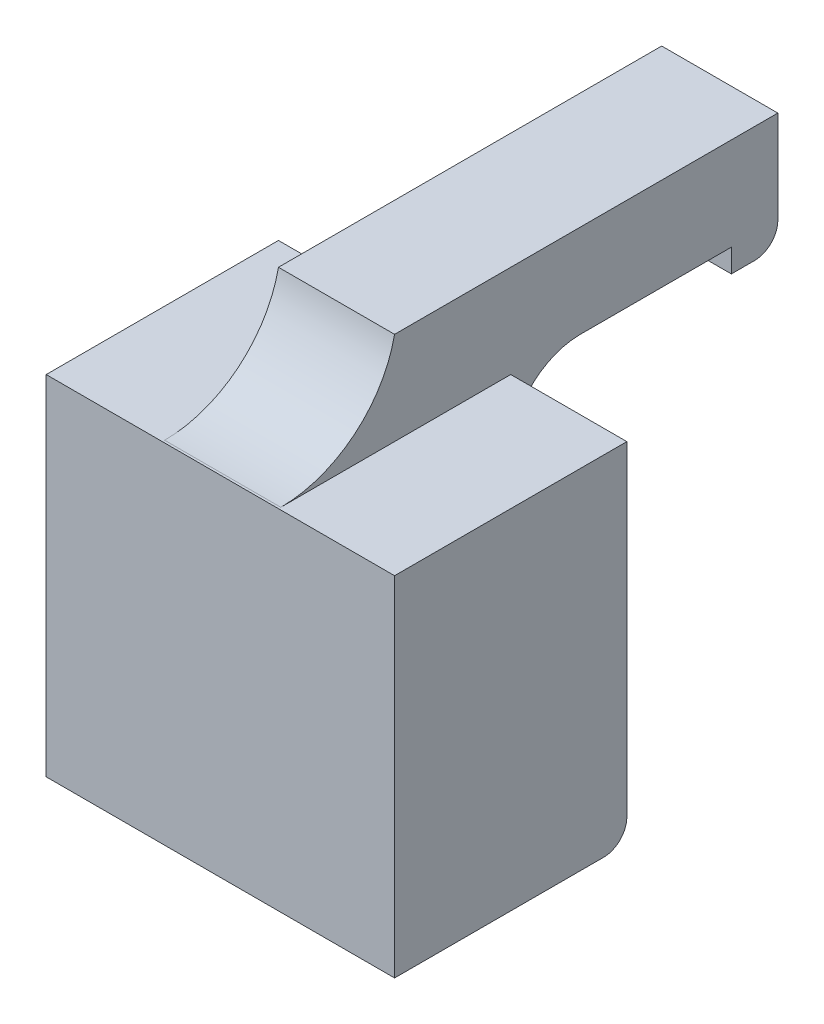
ISO-10303-21;
HEADER;
FILE_DESCRIPTION(('STEP AP214'),'2;1');
FILE_NAME('part.step','',(''),(''),'','','');
FILE_SCHEMA(('AUTOMOTIVE_DESIGN { 1 0 10303 214 1 1 1 1 }'));
ENDSEC;
DATA;
#1=APPLICATION_CONTEXT('core data for automotive mechanical design processes');
#2=APPLICATION_PROTOCOL_DEFINITION('international standard','automotive_design',2000,#1);
#3=PRODUCT_CONTEXT('',#1,'mechanical');
#4=PRODUCT('Part','Part','',(#3));
#5=PRODUCT_RELATED_PRODUCT_CATEGORY('part','',(#4));
#6=PRODUCT_DEFINITION_FORMATION('','',#4);
#7=PRODUCT_DEFINITION_CONTEXT('part definition',#1,'design');
#8=PRODUCT_DEFINITION('design','',#6,#7);
#9=PRODUCT_DEFINITION_SHAPE('','',#8);
#10=(LENGTH_UNIT() NAMED_UNIT(*) SI_UNIT(.MILLI.,.METRE.));
#11=(NAMED_UNIT(*) PLANE_ANGLE_UNIT() SI_UNIT($,.RADIAN.));
#12=(NAMED_UNIT(*) SI_UNIT($,.STERADIAN.) SOLID_ANGLE_UNIT());
#13=UNCERTAINTY_MEASURE_WITH_UNIT(LENGTH_MEASURE(1.E-05),#10,'distance_accuracy_value','');
#14=(GEOMETRIC_REPRESENTATION_CONTEXT(3) GLOBAL_UNCERTAINTY_ASSIGNED_CONTEXT((#13)) GLOBAL_UNIT_ASSIGNED_CONTEXT((#10,
#11,#12)) REPRESENTATION_CONTEXT('',''));
#15=CARTESIAN_POINT('',(0.,0.,0.));
#16=DIRECTION('',(0.,0.,1.));
#17=DIRECTION('',(1.,0.,0.));
#18=AXIS2_PLACEMENT_3D('',#15,#16,#17);
#19=CARTESIAN_POINT('',(0.,7.5,0.));
#20=DIRECTION('',(0.,1.,0.));
#21=DIRECTION('',(0.,0.,1.));
#22=AXIS2_PLACEMENT_3D('',#19,#20,#21);
#23=PLANE('',#22);
#24=DIRECTION('',(-1.,0.,0.));
#25=VECTOR('',#24,1.);
#26=CARTESIAN_POINT('',(-2.5,7.5,-9.5));
#27=LINE('',#26,#25);
#28=CARTESIAN_POINT('',(2.5,7.5,-9.5));
#29=VERTEX_POINT('',#28);
#30=CARTESIAN_POINT('',(-2.5,7.5,-9.5));
#31=VERTEX_POINT('',#30);
#32=EDGE_CURVE('E224',#29,#31,#27,.T.);
#33=ORIENTED_EDGE('',*,*,#32,.F.);
#34=DIRECTION('',(0.,0.,1.));
#35=VECTOR('',#34,1.);
#36=CARTESIAN_POINT('',(2.5,7.5,0.));
#37=LINE('',#36,#35);
#38=CARTESIAN_POINT('',(2.5,7.5,-3.));
#39=VERTEX_POINT('',#38);
#40=EDGE_CURVE('E257',#29,#39,#37,.T.);
#41=ORIENTED_EDGE('',*,*,#40,.T.);
#42=DIRECTION('',(-1.,0.,0.));
#43=VECTOR('',#42,1.);
#44=CARTESIAN_POINT('',(0.,7.5,-3.));
#45=LINE('',#44,#43);
#46=CARTESIAN_POINT('',(-2.5,7.5,-3.));
#47=VERTEX_POINT('',#46);
#48=EDGE_CURVE('E342',#39,#47,#45,.T.);
#49=ORIENTED_EDGE('',*,*,#48,.T.);
#50=DIRECTION('',(0.,0.,-1.));
#51=VECTOR('',#50,1.);
#52=CARTESIAN_POINT('',(-2.5,7.5,0.));
#53=LINE('',#52,#51);
#54=EDGE_CURVE('E251',#47,#31,#53,.T.);
#55=ORIENTED_EDGE('',*,*,#54,.T.);
#56=EDGE_LOOP('',(#33,#41,#49,#55));
#57=FACE_BOUND('',#56,.T.);
#58=ADVANCED_FACE('F41',(#57),#23,.F.);
#59=CARTESIAN_POINT('',(7.5,-7.5,10.));
#60=DIRECTION('',(-1.,0.,0.));
#61=DIRECTION('',(0.,0.,1.));
#62=AXIS2_PLACEMENT_3D('',#59,#60,#61);
#63=PLANE('',#62);
#64=DIRECTION('',(0.,0.,-1.));
#65=VECTOR('',#64,1.);
#66=CARTESIAN_POINT('',(7.5,-7.5,10.));
#67=LINE('',#66,#65);
#68=CARTESIAN_POINT('',(7.5,-7.5,10.));
#69=VERTEX_POINT('',#68);
#70=CARTESIAN_POINT('',(7.5,-7.5,0.999999999999999));
#71=VERTEX_POINT('',#70);
#72=EDGE_CURVE('E308',#69,#71,#67,.T.);
#73=ORIENTED_EDGE('',*,*,#72,.T.);
#74=CARTESIAN_POINT('',(7.5,-6.5,0.999999999999999));
#75=DIRECTION('',(-1.,0.,0.));
#76=DIRECTION('',(0.,0.,1.));
#77=AXIS2_PLACEMENT_3D('',#74,#75,#76);
#78=CIRCLE('',#77,1.);
#79=CARTESIAN_POINT('',(7.5,-6.5,0.));
#80=VERTEX_POINT('',#79);
#81=EDGE_CURVE('E64',#71,#80,#78,.F.);
#82=ORIENTED_EDGE('',*,*,#81,.T.);
#83=DIRECTION('',(0.,1.,0.));
#84=VECTOR('',#83,1.);
#85=CARTESIAN_POINT('',(7.5,-7.5,0.));
#86=LINE('',#85,#84);
#87=CARTESIAN_POINT('',(7.5,7.5,0.));
#88=VERTEX_POINT('',#87);
#89=EDGE_CURVE('E288',#80,#88,#86,.T.);
#90=ORIENTED_EDGE('',*,*,#89,.T.);
#91=DIRECTION('',(0.,0.,-1.));
#92=VECTOR('',#91,1.);
#93=CARTESIAN_POINT('',(7.5,7.5,10.));
#94=LINE('',#93,#92);
#95=CARTESIAN_POINT('',(7.5,7.5,10.));
#96=VERTEX_POINT('',#95);
#97=EDGE_CURVE('E293',#96,#88,#94,.T.);
#98=ORIENTED_EDGE('',*,*,#97,.F.);
#99=DIRECTION('',(0.,1.,0.));
#100=VECTOR('',#99,1.);
#101=CARTESIAN_POINT('',(7.5,-7.5,10.));
#102=LINE('',#101,#100);
#103=EDGE_CURVE('E294',#69,#96,#102,.T.);
#104=ORIENTED_EDGE('',*,*,#103,.F.);
#105=EDGE_LOOP('',(#73,#82,#90,#98,#104));
#106=FACE_BOUND('',#105,.T.);
#107=ADVANCED_FACE('F442',(#106),#63,.F.);
#108=CARTESIAN_POINT('',(-7.5,7.5,10.));
#109=DIRECTION('',(0.,-1.,0.));
#110=DIRECTION('',(0.,0.,-1.));
#111=AXIS2_PLACEMENT_3D('',#108,#109,#110);
#112=PLANE('',#111);
#113=CARTESIAN_POINT('',(2.5,7.5,0.));
#114=VERTEX_POINT('',#113);
#115=CARTESIAN_POINT('',(2.5,7.5,9.89897948556636));
#116=VERTEX_POINT('',#115);
#117=EDGE_CURVE('E276',#114,#116,#37,.T.);
#118=ORIENTED_EDGE('',*,*,#117,.T.);
#119=DIRECTION('',(1.,0.,0.));
#120=VECTOR('',#119,1.);
#121=CARTESIAN_POINT('',(-7.5,7.5,9.89897948556636));
#122=LINE('',#121,#120);
#123=CARTESIAN_POINT('',(-2.5,7.5,9.89897948556636));
#124=VERTEX_POINT('',#123);
#125=EDGE_CURVE('E331',#116,#124,#122,.F.);
#126=ORIENTED_EDGE('',*,*,#125,.T.);
#127=CARTESIAN_POINT('',(-2.5,7.5,0.));
#128=VERTEX_POINT('',#127);
#129=EDGE_CURVE('E270',#124,#128,#53,.T.);
#130=ORIENTED_EDGE('',*,*,#129,.T.);
#131=DIRECTION('',(-1.,0.,0.));
#132=VECTOR('',#131,1.);
#133=CARTESIAN_POINT('',(-7.5,7.5,0.));
#134=LINE('',#133,#132);
#135=CARTESIAN_POINT('',(-7.5,7.5,0.));
#136=VERTEX_POINT('',#135);
#137=EDGE_CURVE('E311',#128,#136,#134,.T.);
#138=ORIENTED_EDGE('',*,*,#137,.T.);
#139=DIRECTION('',(0.,0.,-1.));
#140=VECTOR('',#139,1.);
#141=CARTESIAN_POINT('',(-7.5,7.5,10.));
#142=LINE('',#141,#140);
#143=CARTESIAN_POINT('',(-7.5,7.5,10.));
#144=VERTEX_POINT('',#143);
#145=EDGE_CURVE('E324',#144,#136,#142,.T.);
#146=ORIENTED_EDGE('',*,*,#145,.F.);
#147=DIRECTION('',(-1.,0.,0.));
#148=VECTOR('',#147,1.);
#149=CARTESIAN_POINT('',(-7.5,7.5,10.));
#150=LINE('',#149,#148);
#151=EDGE_CURVE('E298',#96,#144,#150,.T.);
#152=ORIENTED_EDGE('',*,*,#151,.F.);
#153=ORIENTED_EDGE('',*,*,#97,.T.);
#154=EDGE_CURVE('E312',#88,#114,#134,.T.);
#155=ORIENTED_EDGE('',*,*,#154,.T.);
#156=EDGE_LOOP('',(#118,#126,#130,#138,#146,#152,#153,#155));
#157=FACE_BOUND('',#156,.T.);
#158=ADVANCED_FACE('F422',(#157),#112,.F.);
#159=CARTESIAN_POINT('',(-7.5,-7.5,10.));
#160=DIRECTION('',(1.,0.,0.));
#161=DIRECTION('',(0.,0.,-1.));
#162=AXIS2_PLACEMENT_3D('',#159,#160,#161);
#163=PLANE('',#162);
#164=DIRECTION('',(0.,-1.,0.));
#165=VECTOR('',#164,1.);
#166=CARTESIAN_POINT('',(-7.5,-7.5,0.));
#167=LINE('',#166,#165);
#168=CARTESIAN_POINT('',(-7.5,-6.5,0.));
#169=VERTEX_POINT('',#168);
#170=EDGE_CURVE('E299',#136,#169,#167,.T.);
#171=ORIENTED_EDGE('',*,*,#170,.T.);
#172=CARTESIAN_POINT('',(-7.5,-6.5,0.999999999999999));
#173=DIRECTION('',(1.,0.,0.));
#174=DIRECTION('',(0.,0.,-1.));
#175=AXIS2_PLACEMENT_3D('',#172,#173,#174);
#176=CIRCLE('',#175,1.);
#177=CARTESIAN_POINT('',(-7.5,-7.5,0.999999999999999));
#178=VERTEX_POINT('',#177);
#179=EDGE_CURVE('E11',#169,#178,#176,.F.);
#180=ORIENTED_EDGE('',*,*,#179,.T.);
#181=DIRECTION('',(0.,0.,-1.));
#182=VECTOR('',#181,1.);
#183=CARTESIAN_POINT('',(-7.5,-7.5,10.));
#184=LINE('',#183,#182);
#185=CARTESIAN_POINT('',(-7.5,-7.5,10.));
#186=VERTEX_POINT('',#185);
#187=EDGE_CURVE('E320',#186,#178,#184,.T.);
#188=ORIENTED_EDGE('',*,*,#187,.F.);
#189=DIRECTION('',(0.,-1.,0.));
#190=VECTOR('',#189,1.);
#191=CARTESIAN_POINT('',(-7.5,-7.5,10.));
#192=LINE('',#191,#190);
#193=EDGE_CURVE('E302',#144,#186,#192,.T.);
#194=ORIENTED_EDGE('',*,*,#193,.F.);
#195=ORIENTED_EDGE('',*,*,#145,.T.);
#196=EDGE_LOOP('',(#171,#180,#188,#194,#195));
#197=FACE_BOUND('',#196,.T.);
#198=ADVANCED_FACE('F434',(#197),#163,.F.);
#199=CARTESIAN_POINT('',(-7.5,-7.5,10.));
#200=DIRECTION('',(0.,1.,0.));
#201=DIRECTION('',(0.,0.,1.));
#202=AXIS2_PLACEMENT_3D('',#199,#200,#201);
#203=PLANE('',#202);
#204=DIRECTION('',(1.,0.,0.));
#205=VECTOR('',#204,1.);
#206=CARTESIAN_POINT('',(0.,-7.5,1.16149794846327));
#207=LINE('',#206,#205);
#208=CARTESIAN_POINT('',(-2.75,-7.5,1.16149794846327));
#209=VERTEX_POINT('',#208);
#210=CARTESIAN_POINT('',(2.75,-7.5,1.16149794846327));
#211=VERTEX_POINT('',#210);
#212=EDGE_CURVE('E214',#209,#211,#207,.T.);
#213=ORIENTED_EDGE('',*,*,#212,.F.);
#214=DIRECTION('',(0.,0.,-1.));
#215=VECTOR('',#214,1.);
#216=CARTESIAN_POINT('',(-2.75,-7.5,0.));
#217=LINE('',#216,#215);
#218=CARTESIAN_POINT('',(-2.75,-7.5,8.83850205153674));
#219=VERTEX_POINT('',#218);
#220=EDGE_CURVE('E178',#219,#209,#217,.T.);
#221=ORIENTED_EDGE('',*,*,#220,.F.);
#222=DIRECTION('',(1.,0.,0.));
#223=VECTOR('',#222,1.);
#224=CARTESIAN_POINT('',(0.,-7.5,8.83850205153674));
#225=LINE('',#224,#223);
#226=CARTESIAN_POINT('',(2.75,-7.5,8.83850205153674));
#227=VERTEX_POINT('',#226);
#228=EDGE_CURVE('E198',#219,#227,#225,.T.);
#229=ORIENTED_EDGE('',*,*,#228,.T.);
#230=DIRECTION('',(0.,0.,-1.));
#231=VECTOR('',#230,1.);
#232=CARTESIAN_POINT('',(2.75,-7.5,0.));
#233=LINE('',#232,#231);
#234=EDGE_CURVE('E202',#227,#211,#233,.T.);
#235=ORIENTED_EDGE('',*,*,#234,.T.);
#236=EDGE_LOOP('',(#213,#221,#229,#235));
#237=FACE_BOUND('',#236,.T.);
#238=ORIENTED_EDGE('',*,*,#187,.T.);
#239=DIRECTION('',(1.,0.,0.));
#240=VECTOR('',#239,1.);
#241=CARTESIAN_POINT('',(7.5,-7.5,0.999999999999999));
#242=LINE('',#241,#240);
#243=EDGE_CURVE('E377',#178,#71,#242,.T.);
#244=ORIENTED_EDGE('',*,*,#243,.T.);
#245=ORIENTED_EDGE('',*,*,#72,.F.);
#246=DIRECTION('',(1.,0.,0.));
#247=VECTOR('',#246,1.);
#248=CARTESIAN_POINT('',(-7.5,-7.5,10.));
#249=LINE('',#248,#247);
#250=EDGE_CURVE('E305',#186,#69,#249,.T.);
#251=ORIENTED_EDGE('',*,*,#250,.F.);
#252=EDGE_LOOP('',(#238,#244,#245,#251));
#253=FACE_BOUND('',#252,.T.);
#254=ADVANCED_FACE('F488',(#237,#253),#203,.F.);
#255=CARTESIAN_POINT('',(0.,0.,10.));
#256=DIRECTION('',(0.,0.,-1.));
#257=DIRECTION('',(-1.,0.,0.));
#258=AXIS2_PLACEMENT_3D('',#255,#256,#257);
#259=PLANE('',#258);
#260=ORIENTED_EDGE('',*,*,#103,.T.);
#261=ORIENTED_EDGE('',*,*,#151,.T.);
#262=ORIENTED_EDGE('',*,*,#193,.T.);
#263=ORIENTED_EDGE('',*,*,#250,.T.);
#264=EDGE_LOOP('',(#260,#261,#262,#263));
#265=FACE_BOUND('',#264,.T.);
#266=ADVANCED_FACE('F439',(#265),#259,.F.);
#267=CARTESIAN_POINT('',(0.,0.,0.));
#268=DIRECTION('',(0.,0.,-1.));
#269=DIRECTION('',(-1.,0.,0.));
#270=AXIS2_PLACEMENT_3D('',#267,#268,#269);
#271=PLANE('',#270);
#272=CARTESIAN_POINT('',(-5.,0.,0.));
#273=DIRECTION('',(0.,0.,-1.));
#274=DIRECTION('',(-1.,0.,0.));
#275=AXIS2_PLACEMENT_3D('',#272,#273,#274);
#276=CIRCLE('',#275,0.875);
#277=CARTESIAN_POINT('',(-5.875,0.,0.));
#278=VERTEX_POINT('',#277);
#279=EDGE_CURVE('E725',#278,#278,#276,.T.);
#280=ORIENTED_EDGE('',*,*,#279,.F.);
#281=EDGE_LOOP('',(#280));
#282=FACE_BOUND('',#281,.T.);
#283=CARTESIAN_POINT('',(5.,0.,0.));
#284=DIRECTION('',(0.,0.,-1.));
#285=DIRECTION('',(-1.,0.,0.));
#286=AXIS2_PLACEMENT_3D('',#283,#284,#285);
#287=CIRCLE('',#286,1.);
#288=CARTESIAN_POINT('',(4.,0.,0.));
#289=VERTEX_POINT('',#288);
#290=EDGE_CURVE('E205',#289,#289,#287,.T.);
#291=ORIENTED_EDGE('',*,*,#290,.F.);
#292=EDGE_LOOP('',(#291));
#293=FACE_BOUND('',#292,.T.);
#294=CARTESIAN_POINT('',(0.,0.,0.));
#295=DIRECTION('',(0.,0.,-1.));
#296=DIRECTION('',(-1.,0.,0.));
#297=AXIS2_PLACEMENT_3D('',#294,#295,#296);
#298=CIRCLE('',#297,2.75);
#299=CARTESIAN_POINT('',(-2.75,0.,0.));
#300=VERTEX_POINT('',#299);
#301=EDGE_CURVE('E289',#300,#300,#298,.T.);
#302=ORIENTED_EDGE('',*,*,#301,.F.);
#303=EDGE_LOOP('',(#302));
#304=FACE_BOUND('',#303,.T.);
#305=ORIENTED_EDGE('',*,*,#89,.F.);
#306=DIRECTION('',(1.,0.,0.));
#307=VECTOR('',#306,1.);
#308=CARTESIAN_POINT('',(-7.5,-6.5,0.));
#309=LINE('',#308,#307);
#310=EDGE_CURVE('E50',#80,#169,#309,.F.);
#311=ORIENTED_EDGE('',*,*,#310,.T.);
#312=ORIENTED_EDGE('',*,*,#170,.F.);
#313=ORIENTED_EDGE('',*,*,#137,.F.);
#314=DIRECTION('',(0.,-1.,0.));
#315=VECTOR('',#314,1.);
#316=CARTESIAN_POINT('',(-2.5,11.5,0.));
#317=LINE('',#316,#315);
#318=CARTESIAN_POINT('',(-2.5,4.5,0.));
#319=VERTEX_POINT('',#318);
#320=EDGE_CURVE('E353',#128,#319,#317,.T.);
#321=ORIENTED_EDGE('',*,*,#320,.T.);
#322=DIRECTION('',(-1.,0.,0.));
#323=VECTOR('',#322,1.);
#324=CARTESIAN_POINT('',(0.,4.5,0.));
#325=LINE('',#324,#323);
#326=CARTESIAN_POINT('',(2.5,4.5,0.));
#327=VERTEX_POINT('',#326);
#328=EDGE_CURVE('E349',#319,#327,#325,.F.);
#329=ORIENTED_EDGE('',*,*,#328,.T.);
#330=DIRECTION('',(0.,1.,0.));
#331=VECTOR('',#330,1.);
#332=CARTESIAN_POINT('',(2.5,11.5,0.));
#333=LINE('',#332,#331);
#334=EDGE_CURVE('E346',#327,#114,#333,.T.);
#335=ORIENTED_EDGE('',*,*,#334,.T.);
#336=ORIENTED_EDGE('',*,*,#154,.F.);
#337=EDGE_LOOP('',(#305,#311,#312,#313,#321,#329,#335,#336));
#338=FACE_BOUND('',#337,.T.);
#339=ADVANCED_FACE('F425',(#282,#293,#304,#338),#271,.T.);
#340=CARTESIAN_POINT('',(0.,0.,-3.));
#341=DIRECTION('',(0.,0.,1.));
#342=DIRECTION('',(1.,0.,0.));
#343=AXIS2_PLACEMENT_3D('',#340,#341,#342);
#344=CYLINDRICAL_SURFACE('',#343,2.75);
#345=CARTESIAN_POINT('',(0.,0.,-3.));
#346=DIRECTION('',(0.,0.,-1.));
#347=DIRECTION('',(-1.,0.,0.));
#348=AXIS2_PLACEMENT_3D('',#345,#346,#347);
#349=CIRCLE('',#348,2.75);
#350=CARTESIAN_POINT('',(-2.75,0.,-3.));
#351=VERTEX_POINT('',#350);
#352=EDGE_CURVE('E284',#351,#351,#349,.T.);
#353=ORIENTED_EDGE('',*,*,#352,.F.);
#354=EDGE_LOOP('',(#353));
#355=FACE_BOUND('',#354,.T.);
#356=ORIENTED_EDGE('',*,*,#301,.T.);
#357=EDGE_LOOP('',(#356));
#358=FACE_BOUND('',#357,.T.);
#359=ADVANCED_FACE('F481',(#355,#358),#344,.T.);
#360=CARTESIAN_POINT('',(0.,0.,-3.));
#361=DIRECTION('',(0.,0.,-1.));
#362=DIRECTION('',(-1.,0.,0.));
#363=AXIS2_PLACEMENT_3D('',#360,#361,#362);
#364=PLANE('',#363);
#365=ORIENTED_EDGE('',*,*,#352,.T.);
#366=EDGE_LOOP('',(#365));
#367=FACE_BOUND('',#366,.T.);
#368=ADVANCED_FACE('F478',(#367),#364,.T.);
#369=CARTESIAN_POINT('',(-2.5,11.5,0.));
#370=DIRECTION('',(-1.,0.,0.));
#371=DIRECTION('',(0.,0.,1.));
#372=AXIS2_PLACEMENT_3D('',#369,#370,#371);
#373=PLANE('',#372);
#374=DIRECTION('',(0.,-1.,0.));
#375=VECTOR('',#374,1.);
#376=CARTESIAN_POINT('',(-2.5,11.5,-11.5));
#377=LINE('',#376,#375);
#378=CARTESIAN_POINT('',(-2.5,11.5,-11.5));
#379=VERTEX_POINT('',#378);
#380=CARTESIAN_POINT('',(-2.5,7.5,-11.5));
#381=VERTEX_POINT('',#380);
#382=EDGE_CURVE('E269',#379,#381,#377,.T.);
#383=ORIENTED_EDGE('',*,*,#382,.T.);
#384=CARTESIAN_POINT('',(-2.5,7.5,-10.5));
#385=DIRECTION('',(-1.,0.,0.));
#386=DIRECTION('',(0.,0.,1.));
#387=AXIS2_PLACEMENT_3D('',#384,#385,#386);
#388=CIRCLE('',#387,1.);
#389=CARTESIAN_POINT('',(-2.5,6.5,-10.5));
#390=VERTEX_POINT('',#389);
#391=EDGE_CURVE('E374',#381,#390,#388,.T.);
#392=ORIENTED_EDGE('',*,*,#391,.T.);
#393=DIRECTION('',(0.,0.,-1.));
#394=VECTOR('',#393,1.);
#395=CARTESIAN_POINT('',(-2.5,6.5,-11.5));
#396=LINE('',#395,#394);
#397=CARTESIAN_POINT('',(-2.5,6.5,-9.5));
#398=VERTEX_POINT('',#397);
#399=EDGE_CURVE('E230',#398,#390,#396,.T.);
#400=ORIENTED_EDGE('',*,*,#399,.F.);
#401=DIRECTION('',(0.,1.,0.));
#402=VECTOR('',#401,1.);
#403=CARTESIAN_POINT('',(-2.5,6.5,-9.5));
#404=LINE('',#403,#402);
#405=EDGE_CURVE('E240',#398,#31,#404,.T.);
#406=ORIENTED_EDGE('',*,*,#405,.T.);
#407=ORIENTED_EDGE('',*,*,#54,.F.);
#408=CARTESIAN_POINT('',(-2.5,4.5,-3.));
#409=DIRECTION('',(-1.,0.,0.));
#410=DIRECTION('',(0.,0.,1.));
#411=AXIS2_PLACEMENT_3D('',#408,#409,#410);
#412=CIRCLE('',#411,3.);
#413=EDGE_CURVE('E357',#47,#319,#412,.F.);
#414=ORIENTED_EDGE('',*,*,#413,.T.);
#415=ORIENTED_EDGE('',*,*,#320,.F.);
#416=ORIENTED_EDGE('',*,*,#129,.F.);
#417=CARTESIAN_POINT('',(-2.5,12.5,9.89897948556636));
#418=DIRECTION('',(-1.,0.,0.));
#419=DIRECTION('',(0.,0.,1.));
#420=AXIS2_PLACEMENT_3D('',#417,#418,#419);
#421=CIRCLE('',#420,5.);
#422=CARTESIAN_POINT('',(-2.5,11.5,5.));
#423=VERTEX_POINT('',#422);
#424=EDGE_CURVE('E339',#124,#423,#421,.F.);
#425=ORIENTED_EDGE('',*,*,#424,.T.);
#426=DIRECTION('',(0.,0.,-1.));
#427=VECTOR('',#426,1.);
#428=CARTESIAN_POINT('',(-2.5,11.5,0.));
#429=LINE('',#428,#427);
#430=EDGE_CURVE('E252',#423,#379,#429,.T.);
#431=ORIENTED_EDGE('',*,*,#430,.T.);
#432=EDGE_LOOP('',(#383,#392,#400,#406,#407,#414,#415,#416,#425,#431));
#433=FACE_BOUND('',#432,.T.);
#434=ADVANCED_FACE('F397',(#433),#373,.T.);
#435=CARTESIAN_POINT('',(2.5,11.5,0.));
#436=DIRECTION('',(1.,0.,0.));
#437=DIRECTION('',(0.,0.,-1.));
#438=AXIS2_PLACEMENT_3D('',#435,#436,#437);
#439=PLANE('',#438);
#440=DIRECTION('',(0.,0.,1.));
#441=VECTOR('',#440,1.);
#442=CARTESIAN_POINT('',(2.5,6.5,-11.5));
#443=LINE('',#442,#441);
#444=CARTESIAN_POINT('',(2.5,6.5,-10.5));
#445=VERTEX_POINT('',#444);
#446=CARTESIAN_POINT('',(2.5,6.5,-9.5));
#447=VERTEX_POINT('',#446);
#448=EDGE_CURVE('E234',#445,#447,#443,.T.);
#449=ORIENTED_EDGE('',*,*,#448,.F.);
#450=CARTESIAN_POINT('',(2.5,7.5,-10.5));
#451=DIRECTION('',(1.,0.,0.));
#452=DIRECTION('',(0.,0.,-1.));
#453=AXIS2_PLACEMENT_3D('',#450,#451,#452);
#454=CIRCLE('',#453,1.);
#455=CARTESIAN_POINT('',(2.5,7.5,-11.5));
#456=VERTEX_POINT('',#455);
#457=EDGE_CURVE('E368',#445,#456,#454,.T.);
#458=ORIENTED_EDGE('',*,*,#457,.T.);
#459=DIRECTION('',(0.,-1.,0.));
#460=VECTOR('',#459,1.);
#461=CARTESIAN_POINT('',(2.5,11.5,-11.5));
#462=LINE('',#461,#460);
#463=CARTESIAN_POINT('',(2.5,11.5,-11.5));
#464=VERTEX_POINT('',#463);
#465=EDGE_CURVE('E280',#464,#456,#462,.T.);
#466=ORIENTED_EDGE('',*,*,#465,.F.);
#467=DIRECTION('',(0.,0.,1.));
#468=VECTOR('',#467,1.);
#469=CARTESIAN_POINT('',(2.5,11.5,0.));
#470=LINE('',#469,#468);
#471=CARTESIAN_POINT('',(2.5,11.5,5.));
#472=VERTEX_POINT('',#471);
#473=EDGE_CURVE('E261',#464,#472,#470,.T.);
#474=ORIENTED_EDGE('',*,*,#473,.T.);
#475=CARTESIAN_POINT('',(2.5,12.5,9.89897948556636));
#476=DIRECTION('',(1.,0.,0.));
#477=DIRECTION('',(0.,0.,-1.));
#478=AXIS2_PLACEMENT_3D('',#475,#476,#477);
#479=CIRCLE('',#478,5.);
#480=EDGE_CURVE('E335',#472,#116,#479,.F.);
#481=ORIENTED_EDGE('',*,*,#480,.T.);
#482=ORIENTED_EDGE('',*,*,#117,.F.);
#483=ORIENTED_EDGE('',*,*,#334,.F.);
#484=CARTESIAN_POINT('',(2.5,4.5,-3.));
#485=DIRECTION('',(1.,0.,0.));
#486=DIRECTION('',(0.,0.,-1.));
#487=AXIS2_PLACEMENT_3D('',#484,#485,#486);
#488=CIRCLE('',#487,3.);
#489=EDGE_CURVE('E360',#327,#39,#488,.F.);
#490=ORIENTED_EDGE('',*,*,#489,.T.);
#491=ORIENTED_EDGE('',*,*,#40,.F.);
#492=DIRECTION('',(0.,1.,0.));
#493=VECTOR('',#492,1.);
#494=CARTESIAN_POINT('',(2.5,6.5,-9.5));
#495=LINE('',#494,#493);
#496=EDGE_CURVE('E247',#447,#29,#495,.T.);
#497=ORIENTED_EDGE('',*,*,#496,.F.);
#498=EDGE_LOOP('',(#449,#458,#466,#474,#481,#482,#483,#490,#491,#497));
#499=FACE_BOUND('',#498,.T.);
#500=ADVANCED_FACE('F407',(#499),#439,.T.);
#501=CARTESIAN_POINT('',(0.,11.5,-11.5));
#502=DIRECTION('',(0.,0.,-1.));
#503=DIRECTION('',(-1.,0.,0.));
#504=AXIS2_PLACEMENT_3D('',#501,#502,#503);
#505=PLANE('',#504);
#506=ORIENTED_EDGE('',*,*,#465,.T.);
#507=DIRECTION('',(1.,0.,0.));
#508=VECTOR('',#507,1.);
#509=CARTESIAN_POINT('',(-2.5,7.5,-11.5));
#510=LINE('',#509,#508);
#511=EDGE_CURVE('E371',#456,#381,#510,.F.);
#512=ORIENTED_EDGE('',*,*,#511,.T.);
#513=ORIENTED_EDGE('',*,*,#382,.F.);
#514=DIRECTION('',(1.,0.,0.));
#515=VECTOR('',#514,1.);
#516=CARTESIAN_POINT('',(0.,11.5,-11.5));
#517=LINE('',#516,#515);
#518=EDGE_CURVE('E265',#379,#464,#517,.T.);
#519=ORIENTED_EDGE('',*,*,#518,.T.);
#520=EDGE_LOOP('',(#506,#512,#513,#519));
#521=FACE_BOUND('',#520,.T.);
#522=ADVANCED_FACE('F410',(#521),#505,.T.);
#523=CARTESIAN_POINT('',(0.,11.5,0.));
#524=DIRECTION('',(0.,1.,0.));
#525=DIRECTION('',(0.,0.,1.));
#526=AXIS2_PLACEMENT_3D('',#523,#524,#525);
#527=PLANE('',#526);
#528=ORIENTED_EDGE('',*,*,#430,.F.);
#529=DIRECTION('',(1.,0.,0.));
#530=VECTOR('',#529,1.);
#531=CARTESIAN_POINT('',(0.,11.5,5.));
#532=LINE('',#531,#530);
#533=EDGE_CURVE('E256',#423,#472,#532,.T.);
#534=ORIENTED_EDGE('',*,*,#533,.T.);
#535=ORIENTED_EDGE('',*,*,#473,.F.);
#536=ORIENTED_EDGE('',*,*,#518,.F.);
#537=EDGE_LOOP('',(#528,#534,#535,#536));
#538=FACE_BOUND('',#537,.T.);
#539=ADVANCED_FACE('F414',(#538),#527,.T.);
#540=CARTESIAN_POINT('',(0.,12.5,9.89897948556636));
#541=DIRECTION('',(1.,0.,0.));
#542=DIRECTION('',(0.,0.,-1.));
#543=AXIS2_PLACEMENT_3D('',#540,#541,#542);
#544=CYLINDRICAL_SURFACE('',#543,5.);
#545=ORIENTED_EDGE('',*,*,#424,.F.);
#546=ORIENTED_EDGE('',*,*,#125,.F.);
#547=ORIENTED_EDGE('',*,*,#480,.F.);
#548=ORIENTED_EDGE('',*,*,#533,.F.);
#549=EDGE_LOOP('',(#545,#546,#547,#548));
#550=FACE_BOUND('',#549,.T.);
#551=ADVANCED_FACE('F420',(#550),#544,.F.);
#552=CARTESIAN_POINT('',(0.,4.5,-3.));
#553=DIRECTION('',(-1.,0.,0.));
#554=DIRECTION('',(0.,0.,1.));
#555=AXIS2_PLACEMENT_3D('',#552,#553,#554);
#556=CYLINDRICAL_SURFACE('',#555,3.);
#557=ORIENTED_EDGE('',*,*,#489,.F.);
#558=ORIENTED_EDGE('',*,*,#328,.F.);
#559=ORIENTED_EDGE('',*,*,#413,.F.);
#560=ORIENTED_EDGE('',*,*,#48,.F.);
#561=EDGE_LOOP('',(#557,#558,#559,#560));
#562=FACE_BOUND('',#561,.T.);
#563=ADVANCED_FACE('F429',(#562),#556,.F.);
#564=CARTESIAN_POINT('',(-2.5,6.5,-9.5));
#565=DIRECTION('',(0.,0.,-1.));
#566=DIRECTION('',(-1.,0.,0.));
#567=AXIS2_PLACEMENT_3D('',#564,#565,#566);
#568=PLANE('',#567);
#569=ORIENTED_EDGE('',*,*,#32,.T.);
#570=ORIENTED_EDGE('',*,*,#405,.F.);
#571=DIRECTION('',(-1.,0.,0.));
#572=VECTOR('',#571,1.);
#573=CARTESIAN_POINT('',(-2.5,6.5,-9.5));
#574=LINE('',#573,#572);
#575=EDGE_CURVE('E237',#447,#398,#574,.T.);
#576=ORIENTED_EDGE('',*,*,#575,.F.);
#577=ORIENTED_EDGE('',*,*,#496,.T.);
#578=EDGE_LOOP('',(#569,#570,#576,#577));
#579=FACE_BOUND('',#578,.T.);
#580=ADVANCED_FACE('F393',(#579),#568,.F.);
#581=CARTESIAN_POINT('',(0.,6.5,0.));
#582=DIRECTION('',(0.,1.,0.));
#583=DIRECTION('',(0.,0.,1.));
#584=AXIS2_PLACEMENT_3D('',#581,#582,#583);
#585=PLANE('',#584);
#586=ORIENTED_EDGE('',*,*,#399,.T.);
#587=DIRECTION('',(1.,0.,0.));
#588=VECTOR('',#587,1.);
#589=CARTESIAN_POINT('',(2.5,6.5,-10.5));
#590=LINE('',#589,#588);
#591=EDGE_CURVE('E364',#390,#445,#590,.T.);
#592=ORIENTED_EDGE('',*,*,#591,.T.);
#593=ORIENTED_EDGE('',*,*,#448,.T.);
#594=ORIENTED_EDGE('',*,*,#575,.T.);
#595=EDGE_LOOP('',(#586,#592,#593,#594));
#596=FACE_BOUND('',#595,.T.);
#597=ADVANCED_FACE('F401',(#596),#585,.F.);
#598=CARTESIAN_POINT('',(0.,7.5,-10.5));
#599=DIRECTION('',(-1.,0.,0.));
#600=DIRECTION('',(0.,0.,1.));
#601=AXIS2_PLACEMENT_3D('',#598,#599,#600);
#602=CYLINDRICAL_SURFACE('',#601,1.);
#603=ORIENTED_EDGE('',*,*,#391,.F.);
#604=ORIENTED_EDGE('',*,*,#511,.F.);
#605=ORIENTED_EDGE('',*,*,#457,.F.);
#606=ORIENTED_EDGE('',*,*,#591,.F.);
#607=EDGE_LOOP('',(#603,#604,#605,#606));
#608=FACE_BOUND('',#607,.T.);
#609=ADVANCED_FACE('F404',(#608),#602,.T.);
#610=CARTESIAN_POINT('',(-2.75,-6.5,0.));
#611=DIRECTION('',(-1.,0.,0.));
#612=DIRECTION('',(0.,0.,1.));
#613=AXIS2_PLACEMENT_3D('',#610,#611,#612);
#614=PLANE('',#613);
#615=ORIENTED_EDGE('',*,*,#220,.T.);
#616=DIRECTION('',(0.,-1.,0.));
#617=VECTOR('',#616,1.);
#618=CARTESIAN_POINT('',(-2.75,-6.5,1.16149794846327));
#619=LINE('',#618,#617);
#620=CARTESIAN_POINT('',(-2.75,-6.5,1.16149794846327));
#621=VERTEX_POINT('',#620);
#622=EDGE_CURVE('E172',#621,#209,#619,.T.);
#623=ORIENTED_EDGE('',*,*,#622,.F.);
#624=DIRECTION('',(0.,0.,-1.));
#625=VECTOR('',#624,1.);
#626=CARTESIAN_POINT('',(-2.75,-6.5,0.));
#627=LINE('',#626,#625);
#628=CARTESIAN_POINT('',(-2.75,-6.5,8.83850205153674));
#629=VERTEX_POINT('',#628);
#630=EDGE_CURVE('E176',#629,#621,#627,.T.);
#631=ORIENTED_EDGE('',*,*,#630,.F.);
#632=DIRECTION('',(0.,-1.,0.));
#633=VECTOR('',#632,1.);
#634=CARTESIAN_POINT('',(-2.75,-6.5,8.83850205153674));
#635=LINE('',#634,#633);
#636=EDGE_CURVE('E221',#629,#219,#635,.T.);
#637=ORIENTED_EDGE('',*,*,#636,.T.);
#638=EDGE_LOOP('',(#615,#623,#631,#637));
#639=FACE_BOUND('',#638,.T.);
#640=ADVANCED_FACE('F174',(#639),#614,.F.);
#641=CARTESIAN_POINT('',(0.,-6.5,8.83850205153674));
#642=DIRECTION('',(0.,0.,-1.));
#643=DIRECTION('',(-1.,0.,0.));
#644=AXIS2_PLACEMENT_3D('',#641,#642,#643);
#645=PLANE('',#644);
#646=ORIENTED_EDGE('',*,*,#228,.F.);
#647=ORIENTED_EDGE('',*,*,#636,.F.);
#648=DIRECTION('',(1.,0.,0.));
#649=VECTOR('',#648,1.);
#650=CARTESIAN_POINT('',(0.,-6.5,8.83850205153674));
#651=LINE('',#650,#649);
#652=CARTESIAN_POINT('',(2.75,-6.5,8.83850205153674));
#653=VERTEX_POINT('',#652);
#654=EDGE_CURVE('E184',#629,#653,#651,.T.);
#655=ORIENTED_EDGE('',*,*,#654,.T.);
#656=DIRECTION('',(0.,-1.,0.));
#657=VECTOR('',#656,1.);
#658=CARTESIAN_POINT('',(2.75,-6.5,8.83850205153674));
#659=LINE('',#658,#657);
#660=EDGE_CURVE('E225',#653,#227,#659,.T.);
#661=ORIENTED_EDGE('',*,*,#660,.T.);
#662=EDGE_LOOP('',(#646,#647,#655,#661));
#663=FACE_BOUND('',#662,.T.);
#664=ADVANCED_FACE('F461',(#663),#645,.T.);
#665=CARTESIAN_POINT('',(2.75,-6.5,0.));
#666=DIRECTION('',(-1.,0.,0.));
#667=DIRECTION('',(0.,0.,1.));
#668=AXIS2_PLACEMENT_3D('',#665,#666,#667);
#669=PLANE('',#668);
#670=ORIENTED_EDGE('',*,*,#234,.F.);
#671=ORIENTED_EDGE('',*,*,#660,.F.);
#672=DIRECTION('',(0.,0.,-1.));
#673=VECTOR('',#672,1.);
#674=CARTESIAN_POINT('',(2.75,-6.5,0.));
#675=LINE('',#674,#673);
#676=CARTESIAN_POINT('',(2.75,-6.5,1.16149794846327));
#677=VERTEX_POINT('',#676);
#678=EDGE_CURVE('E193',#653,#677,#675,.T.);
#679=ORIENTED_EDGE('',*,*,#678,.T.);
#680=DIRECTION('',(0.,-1.,0.));
#681=VECTOR('',#680,1.);
#682=CARTESIAN_POINT('',(2.75,-6.5,1.16149794846327));
#683=LINE('',#682,#681);
#684=EDGE_CURVE('E183',#677,#211,#683,.T.);
#685=ORIENTED_EDGE('',*,*,#684,.T.);
#686=EDGE_LOOP('',(#670,#671,#679,#685));
#687=FACE_BOUND('',#686,.T.);
#688=ADVANCED_FACE('F668',(#687),#669,.T.);
#689=CARTESIAN_POINT('',(0.,-6.5,1.16149794846327));
#690=DIRECTION('',(0.,0.,-1.));
#691=DIRECTION('',(-1.,0.,0.));
#692=AXIS2_PLACEMENT_3D('',#689,#690,#691);
#693=PLANE('',#692);
#694=ORIENTED_EDGE('',*,*,#212,.T.);
#695=ORIENTED_EDGE('',*,*,#684,.F.);
#696=DIRECTION('',(1.,0.,0.));
#697=VECTOR('',#696,1.);
#698=CARTESIAN_POINT('',(0.,-6.5,1.16149794846327));
#699=LINE('',#698,#697);
#700=EDGE_CURVE('E188',#621,#677,#699,.T.);
#701=ORIENTED_EDGE('',*,*,#700,.F.);
#702=ORIENTED_EDGE('',*,*,#622,.T.);
#703=EDGE_LOOP('',(#694,#695,#701,#702));
#704=FACE_BOUND('',#703,.T.);
#705=ADVANCED_FACE('F189',(#704),#693,.F.);
#706=CARTESIAN_POINT('',(0.,-6.5,0.));
#707=DIRECTION('',(0.,-1.,0.));
#708=DIRECTION('',(0.,0.,-1.));
#709=AXIS2_PLACEMENT_3D('',#706,#707,#708);
#710=PLANE('',#709);
#711=ORIENTED_EDGE('',*,*,#630,.T.);
#712=ORIENTED_EDGE('',*,*,#700,.T.);
#713=ORIENTED_EDGE('',*,*,#678,.F.);
#714=ORIENTED_EDGE('',*,*,#654,.F.);
#715=EDGE_LOOP('',(#711,#712,#713,#714));
#716=FACE_BOUND('',#715,.T.);
#717=ADVANCED_FACE('F196',(#716),#710,.T.);
#718=CARTESIAN_POINT('',(5.,0.,8.));
#719=DIRECTION('',(0.,0.,-1.));
#720=DIRECTION('',(-1.,0.,0.));
#721=AXIS2_PLACEMENT_3D('',#718,#719,#720);
#722=CYLINDRICAL_SURFACE('',#721,1.);
#723=CARTESIAN_POINT('',(5.,0.,8.));
#724=DIRECTION('',(0.,0.,-1.));
#725=DIRECTION('',(-1.,0.,0.));
#726=AXIS2_PLACEMENT_3D('',#723,#724,#725);
#727=CIRCLE('',#726,1.);
#728=CARTESIAN_POINT('',(4.,0.,8.));
#729=VERTEX_POINT('',#728);
#730=EDGE_CURVE('E215',#729,#729,#727,.T.);
#731=ORIENTED_EDGE('',*,*,#730,.F.);
#732=EDGE_LOOP('',(#731));
#733=FACE_BOUND('',#732,.T.);
#734=ORIENTED_EDGE('',*,*,#290,.T.);
#735=EDGE_LOOP('',(#734));
#736=FACE_BOUND('',#735,.T.);
#737=ADVANCED_FACE('F640',(#733,#736),#722,.F.);
#738=CARTESIAN_POINT('',(0.,0.,8.));
#739=DIRECTION('',(0.,0.,-1.));
#740=DIRECTION('',(-1.,0.,0.));
#741=AXIS2_PLACEMENT_3D('',#738,#739,#740);
#742=PLANE('',#741);
#743=ORIENTED_EDGE('',*,*,#730,.T.);
#744=EDGE_LOOP('',(#743));
#745=FACE_BOUND('',#744,.T.);
#746=ADVANCED_FACE('F630',(#745),#742,.T.);
#747=CARTESIAN_POINT('',(-5.,0.,-7.5));
#748=DIRECTION('',(0.,0.,1.));
#749=DIRECTION('',(1.,0.,0.));
#750=AXIS2_PLACEMENT_3D('',#747,#748,#749);
#751=CYLINDRICAL_SURFACE('',#750,0.875);
#752=CARTESIAN_POINT('',(-5.,0.,-7.5));
#753=DIRECTION('',(0.,0.,-1.));
#754=DIRECTION('',(-1.,0.,0.));
#755=AXIS2_PLACEMENT_3D('',#752,#753,#754);
#756=CIRCLE('',#755,0.875);
#757=CARTESIAN_POINT('',(-5.875,0.,-7.5));
#758=VERTEX_POINT('',#757);
#759=EDGE_CURVE('E721',#758,#758,#756,.T.);
#760=ORIENTED_EDGE('',*,*,#759,.F.);
#761=EDGE_LOOP('',(#760));
#762=FACE_BOUND('',#761,.T.);
#763=ORIENTED_EDGE('',*,*,#279,.T.);
#764=EDGE_LOOP('',(#763));
#765=FACE_BOUND('',#764,.T.);
#766=ADVANCED_FACE('F618',(#762,#765),#751,.T.);
#767=CARTESIAN_POINT('',(0.,0.,-7.5));
#768=DIRECTION('',(0.,0.,-1.));
#769=DIRECTION('',(-1.,0.,0.));
#770=AXIS2_PLACEMENT_3D('',#767,#768,#769);
#771=PLANE('',#770);
#772=ORIENTED_EDGE('',*,*,#759,.T.);
#773=EDGE_LOOP('',(#772));
#774=FACE_BOUND('',#773,.T.);
#775=ADVANCED_FACE('F613',(#774),#771,.T.);
#776=CARTESIAN_POINT('',(-7.5,-6.5,0.999999999999999));
#777=DIRECTION('',(-1.,0.,0.));
#778=DIRECTION('',(0.,0.,1.));
#779=AXIS2_PLACEMENT_3D('',#776,#777,#778);
#780=CYLINDRICAL_SURFACE('',#779,1.);
#781=ORIENTED_EDGE('',*,*,#179,.F.);
#782=ORIENTED_EDGE('',*,*,#310,.F.);
#783=ORIENTED_EDGE('',*,*,#81,.F.);
#784=ORIENTED_EDGE('',*,*,#243,.F.);
#785=EDGE_LOOP('',(#781,#782,#783,#784));
#786=FACE_BOUND('',#785,.T.);
#787=ADVANCED_FACE('F43',(#786),#780,.T.);
#788=CLOSED_SHELL('',(#58,#107,#158,#198,#254,#266,#339,#359,#368,#434,#500,#522,#539,#551,#563,
#580,#597,#609,#640,#664,#688,#705,#717,#737,#746,#766,#775,#787));
#789=MANIFOLD_SOLID_BREP('B2',#788);
#790=ADVANCED_BREP_SHAPE_REPRESENTATION('',(#18,#789),#14);
#791=SHAPE_DEFINITION_REPRESENTATION(#9,#790);
ENDSEC;
END-ISO-10303-21;
